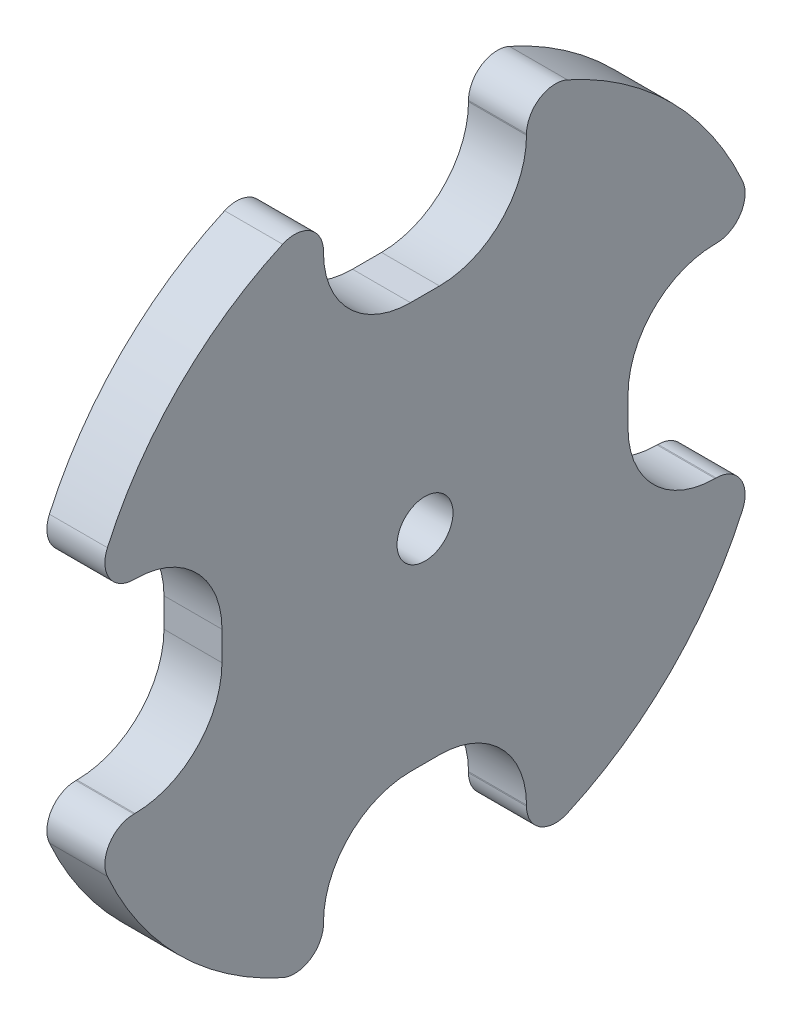
ISO-10303-21;
HEADER;
FILE_DESCRIPTION(('STEP AP214'),'2;1');
FILE_NAME('part.step','',(''),(''),'','','');
FILE_SCHEMA(('AUTOMOTIVE_DESIGN { 1 0 10303 214 1 1 1 1 }'));
ENDSEC;
DATA;
#1=APPLICATION_CONTEXT('core data for automotive mechanical design processes');
#2=APPLICATION_PROTOCOL_DEFINITION('international standard','automotive_design',2000,#1);
#3=PRODUCT_CONTEXT('',#1,'mechanical');
#4=PRODUCT('Part','Part','',(#3));
#5=PRODUCT_RELATED_PRODUCT_CATEGORY('part','',(#4));
#6=PRODUCT_DEFINITION_FORMATION('','',#4);
#7=PRODUCT_DEFINITION_CONTEXT('part definition',#1,'design');
#8=PRODUCT_DEFINITION('design','',#6,#7);
#9=PRODUCT_DEFINITION_SHAPE('','',#8);
#10=(LENGTH_UNIT() NAMED_UNIT(*) SI_UNIT(.MILLI.,.METRE.));
#11=(NAMED_UNIT(*) PLANE_ANGLE_UNIT() SI_UNIT($,.RADIAN.));
#12=(NAMED_UNIT(*) SI_UNIT($,.STERADIAN.) SOLID_ANGLE_UNIT());
#13=UNCERTAINTY_MEASURE_WITH_UNIT(LENGTH_MEASURE(1.E-05),#10,'distance_accuracy_value','');
#14=(GEOMETRIC_REPRESENTATION_CONTEXT(3) GLOBAL_UNCERTAINTY_ASSIGNED_CONTEXT((#13)) GLOBAL_UNIT_ASSIGNED_CONTEXT((#10,
#11,#12)) REPRESENTATION_CONTEXT('',''));
#15=CARTESIAN_POINT('',(0.,0.,0.));
#16=DIRECTION('',(0.,0.,1.));
#17=DIRECTION('',(1.,0.,0.));
#18=AXIS2_PLACEMENT_3D('',#15,#16,#17);
#19=CARTESIAN_POINT('',(2.,0.,0.));
#20=DIRECTION('',(-1.,0.,0.));
#21=DIRECTION('',(0.,0.,1.));
#22=AXIS2_PLACEMENT_3D('',#19,#20,#21);
#23=CYLINDRICAL_SURFACE('',#22,12.);
#24=CARTESIAN_POINT('',(0.,0.,0.));
#25=DIRECTION('',(1.,0.,0.));
#26=DIRECTION('',(0.,0.,-1.));
#27=AXIS2_PLACEMENT_3D('',#24,#25,#26);
#28=CIRCLE('',#27,12.);
#29=CARTESIAN_POINT('',(0.,10.9499235817553,4.90909090909091));
#30=VERTEX_POINT('',#29);
#31=CARTESIAN_POINT('',(0.,4.90909090909102,10.9499235817553));
#32=VERTEX_POINT('',#31);
#33=EDGE_CURVE('E414',#30,#32,#28,.T.);
#34=ORIENTED_EDGE('',*,*,#33,.T.);
#35=DIRECTION('',(-1.,0.,0.));
#36=VECTOR('',#35,1.);
#37=CARTESIAN_POINT('',(2.,4.90909090909102,10.9499235817553));
#38=LINE('',#37,#36);
#39=CARTESIAN_POINT('',(2.,4.90909090909102,10.9499235817553));
#40=VERTEX_POINT('',#39);
#41=EDGE_CURVE('E471',#32,#40,#38,.F.);
#42=ORIENTED_EDGE('',*,*,#41,.T.);
#43=CARTESIAN_POINT('',(2.,0.,0.));
#44=DIRECTION('',(1.,0.,0.));
#45=DIRECTION('',(0.,0.,-1.));
#46=AXIS2_PLACEMENT_3D('',#43,#44,#45);
#47=CIRCLE('',#46,12.);
#48=CARTESIAN_POINT('',(2.,10.9499235817553,4.90909090909091));
#49=VERTEX_POINT('',#48);
#50=EDGE_CURVE('E410',#49,#40,#47,.T.);
#51=ORIENTED_EDGE('',*,*,#50,.F.);
#52=DIRECTION('',(-1.,0.,0.));
#53=VECTOR('',#52,1.);
#54=CARTESIAN_POINT('',(2.,10.9499235817553,4.90909090909091));
#55=LINE('',#54,#53);
#56=EDGE_CURVE('E468',#49,#30,#55,.T.);
#57=ORIENTED_EDGE('',*,*,#56,.T.);
#58=EDGE_LOOP('',(#34,#42,#51,#57));
#59=FACE_BOUND('',#58,.T.);
#60=ADVANCED_FACE('F37',(#59),#23,.T.);
#61=CARTESIAN_POINT('',(2.,0.,0.));
#62=DIRECTION('',(1.,0.,0.));
#63=DIRECTION('',(0.,0.,-1.));
#64=AXIS2_PLACEMENT_3D('',#61,#62,#63);
#65=PLANE('',#64);
#66=CARTESIAN_POINT('',(2.,0.,0.));
#67=DIRECTION('',(1.,0.,0.));
#68=DIRECTION('',(0.,0.,-1.));
#69=AXIS2_PLACEMENT_3D('',#66,#67,#68);
#70=CIRCLE('',#69,0.965);
#71=CARTESIAN_POINT('',(2.,0.,-0.965));
#72=VERTEX_POINT('',#71);
#73=EDGE_CURVE('E406',#72,#72,#70,.T.);
#74=ORIENTED_EDGE('',*,*,#73,.F.);
#75=EDGE_LOOP('',(#74));
#76=FACE_BOUND('',#75,.T.);
#77=DIRECTION('',(0.,-1.,0.));
#78=VECTOR('',#77,1.);
#79=CARTESIAN_POINT('',(2.,0.,-3.5));
#80=LINE('',#79,#78);
#81=CARTESIAN_POINT('',(2.,-10.,-3.5));
#82=VERTEX_POINT('',#81);
#83=CARTESIAN_POINT('',(2.,-10.0374299499424,-3.5));
#84=VERTEX_POINT('',#83);
#85=EDGE_CURVE('E308',#82,#84,#80,.T.);
#86=ORIENTED_EDGE('',*,*,#85,.T.);
#87=CARTESIAN_POINT('',(2.,-10.0374299499424,-4.5));
#88=DIRECTION('',(1.,0.,0.));
#89=DIRECTION('',(0.,0.,-1.));
#90=AXIS2_PLACEMENT_3D('',#87,#88,#89);
#91=CIRCLE('',#90,1.);
#92=CARTESIAN_POINT('',(2.,-10.9499235817553,-4.90909090909091));
#93=VERTEX_POINT('',#92);
#94=EDGE_CURVE('E453',#84,#93,#91,.T.);
#95=ORIENTED_EDGE('',*,*,#94,.T.);
#96=CARTESIAN_POINT('',(2.,-4.90909090909095,-10.9499235817553));
#97=VERTEX_POINT('',#96);
#98=EDGE_CURVE('E403',#93,#97,#47,.T.);
#99=ORIENTED_EDGE('',*,*,#98,.T.);
#100=CARTESIAN_POINT('',(2.,-4.50000000000004,-10.0374299499424));
#101=DIRECTION('',(1.,0.,0.));
#102=DIRECTION('',(0.,0.,-1.));
#103=AXIS2_PLACEMENT_3D('',#100,#101,#102);
#104=CIRCLE('',#103,1.);
#105=CARTESIAN_POINT('',(2.,-3.50000000000004,-10.0374299499424));
#106=VERTEX_POINT('',#105);
#107=EDGE_CURVE('E445',#97,#106,#104,.T.);
#108=ORIENTED_EDGE('',*,*,#107,.T.);
#109=DIRECTION('',(0.,0.,-1.));
#110=VECTOR('',#109,1.);
#111=CARTESIAN_POINT('',(2.,-3.5,0.));
#112=LINE('',#111,#110);
#113=CARTESIAN_POINT('',(2.,-3.50000000000004,-9.99999999999999));
#114=VERTEX_POINT('',#113);
#115=EDGE_CURVE('E340',#114,#106,#112,.T.);
#116=ORIENTED_EDGE('',*,*,#115,.F.);
#117=CARTESIAN_POINT('',(2.,-0.500000000000035,-10.));
#118=DIRECTION('',(1.,0.,0.));
#119=DIRECTION('',(0.,-1.,0.));
#120=AXIS2_PLACEMENT_3D('',#117,#118,#119);
#121=CIRCLE('',#120,3.);
#122=CARTESIAN_POINT('',(2.,-0.500000000000024,-7.));
#123=VERTEX_POINT('',#122);
#124=EDGE_CURVE('E338',#123,#114,#121,.T.);
#125=ORIENTED_EDGE('',*,*,#124,.F.);
#126=DIRECTION('',(0.,-1.,0.));
#127=VECTOR('',#126,1.);
#128=CARTESIAN_POINT('',(2.,0.,-7.));
#129=LINE('',#128,#127);
#130=CARTESIAN_POINT('',(2.,0.499999999999976,-7.));
#131=VERTEX_POINT('',#130);
#132=EDGE_CURVE('E335',#131,#123,#129,.T.);
#133=ORIENTED_EDGE('',*,*,#132,.F.);
#134=CARTESIAN_POINT('',(2.,0.499999999999965,-10.));
#135=DIRECTION('',(1.,0.,0.));
#136=DIRECTION('',(0.,-1.,0.));
#137=AXIS2_PLACEMENT_3D('',#134,#135,#136);
#138=CIRCLE('',#137,3.);
#139=CARTESIAN_POINT('',(2.,3.49999999999996,-10.));
#140=VERTEX_POINT('',#139);
#141=EDGE_CURVE('E332',#131,#140,#138,.F.);
#142=ORIENTED_EDGE('',*,*,#141,.T.);
#143=DIRECTION('',(0.,0.,-1.));
#144=VECTOR('',#143,1.);
#145=CARTESIAN_POINT('',(2.,3.5,0.));
#146=LINE('',#145,#144);
#147=CARTESIAN_POINT('',(2.,3.49999999999996,-10.0374299499424));
#148=VERTEX_POINT('',#147);
#149=EDGE_CURVE('E343',#140,#148,#146,.T.);
#150=ORIENTED_EDGE('',*,*,#149,.T.);
#151=CARTESIAN_POINT('',(2.,4.49999999999997,-10.0374299499424));
#152=DIRECTION('',(1.,0.,0.));
#153=DIRECTION('',(0.,0.,-1.));
#154=AXIS2_PLACEMENT_3D('',#151,#152,#153);
#155=CIRCLE('',#154,1.);
#156=CARTESIAN_POINT('',(2.,4.90909090909087,-10.9499235817553));
#157=VERTEX_POINT('',#156);
#158=EDGE_CURVE('E443',#148,#157,#155,.T.);
#159=ORIENTED_EDGE('',*,*,#158,.T.);
#160=CARTESIAN_POINT('',(2.,10.9499235817553,-4.90909090909091));
#161=VERTEX_POINT('',#160);
#162=EDGE_CURVE('E401',#157,#161,#47,.T.);
#163=ORIENTED_EDGE('',*,*,#162,.T.);
#164=CARTESIAN_POINT('',(2.,10.0374299499424,-4.5));
#165=DIRECTION('',(1.,0.,0.));
#166=DIRECTION('',(0.,0.,-1.));
#167=AXIS2_PLACEMENT_3D('',#164,#165,#166);
#168=CIRCLE('',#167,1.);
#169=CARTESIAN_POINT('',(2.,10.0374299499424,-3.5));
#170=VERTEX_POINT('',#169);
#171=EDGE_CURVE('E58',#161,#170,#168,.T.);
#172=ORIENTED_EDGE('',*,*,#171,.T.);
#173=DIRECTION('',(0.,1.,0.));
#174=VECTOR('',#173,1.);
#175=CARTESIAN_POINT('',(2.,0.,-3.5));
#176=LINE('',#175,#174);
#177=CARTESIAN_POINT('',(2.,10.,-3.5));
#178=VERTEX_POINT('',#177);
#179=EDGE_CURVE('E376',#178,#170,#176,.T.);
#180=ORIENTED_EDGE('',*,*,#179,.F.);
#181=CARTESIAN_POINT('',(2.,10.,-0.5));
#182=DIRECTION('',(1.,0.,0.));
#183=DIRECTION('',(0.,0.,-1.));
#184=AXIS2_PLACEMENT_3D('',#181,#182,#183);
#185=CIRCLE('',#184,3.);
#186=CARTESIAN_POINT('',(2.,7.,-0.5));
#187=VERTEX_POINT('',#186);
#188=EDGE_CURVE('E374',#187,#178,#185,.T.);
#189=ORIENTED_EDGE('',*,*,#188,.F.);
#190=DIRECTION('',(0.,0.,-1.));
#191=VECTOR('',#190,1.);
#192=CARTESIAN_POINT('',(2.,7.,0.));
#193=LINE('',#192,#191);
#194=CARTESIAN_POINT('',(2.,7.,0.5));
#195=VERTEX_POINT('',#194);
#196=EDGE_CURVE('E371',#195,#187,#193,.T.);
#197=ORIENTED_EDGE('',*,*,#196,.F.);
#198=CARTESIAN_POINT('',(2.,10.,0.5));
#199=DIRECTION('',(1.,0.,0.));
#200=DIRECTION('',(0.,0.,-1.));
#201=AXIS2_PLACEMENT_3D('',#198,#199,#200);
#202=CIRCLE('',#201,3.);
#203=CARTESIAN_POINT('',(2.,10.,3.5));
#204=VERTEX_POINT('',#203);
#205=EDGE_CURVE('E368',#195,#204,#202,.F.);
#206=ORIENTED_EDGE('',*,*,#205,.T.);
#207=DIRECTION('',(0.,1.,0.));
#208=VECTOR('',#207,1.);
#209=CARTESIAN_POINT('',(2.,0.,3.5));
#210=LINE('',#209,#208);
#211=CARTESIAN_POINT('',(2.,10.0374299499424,3.5));
#212=VERTEX_POINT('',#211);
#213=EDGE_CURVE('E378',#204,#212,#210,.T.);
#214=ORIENTED_EDGE('',*,*,#213,.T.);
#215=CARTESIAN_POINT('',(2.,10.0374299499424,4.5));
#216=DIRECTION('',(1.,0.,0.));
#217=DIRECTION('',(0.,0.,-1.));
#218=AXIS2_PLACEMENT_3D('',#215,#216,#217);
#219=CIRCLE('',#218,1.);
#220=EDGE_CURVE('E440',#212,#49,#219,.T.);
#221=ORIENTED_EDGE('',*,*,#220,.T.);
#222=ORIENTED_EDGE('',*,*,#50,.T.);
#223=CARTESIAN_POINT('',(2.,4.50000000000011,10.0374299499423));
#224=DIRECTION('',(1.,0.,0.));
#225=DIRECTION('',(0.,0.,-1.));
#226=AXIS2_PLACEMENT_3D('',#223,#224,#225);
#227=CIRCLE('',#226,1.);
#228=CARTESIAN_POINT('',(2.,3.5000000000001,10.0374299499423));
#229=VERTEX_POINT('',#228);
#230=EDGE_CURVE('E447',#40,#229,#227,.T.);
#231=ORIENTED_EDGE('',*,*,#230,.T.);
#232=DIRECTION('',(0.,0.,1.));
#233=VECTOR('',#232,1.);
#234=CARTESIAN_POINT('',(2.,3.5,0.));
#235=LINE('',#234,#233);
#236=CARTESIAN_POINT('',(2.,3.5000000000001,9.99999999999996));
#237=VERTEX_POINT('',#236);
#238=EDGE_CURVE('E275',#237,#229,#235,.T.);
#239=ORIENTED_EDGE('',*,*,#238,.F.);
#240=CARTESIAN_POINT('',(2.,0.500000000000105,9.99999999999999));
#241=DIRECTION('',(1.,0.,0.));
#242=DIRECTION('',(0.,1.,0.));
#243=AXIS2_PLACEMENT_3D('',#240,#241,#242);
#244=CIRCLE('',#243,3.);
#245=CARTESIAN_POINT('',(2.,0.500000000000073,6.99999999999999));
#246=VERTEX_POINT('',#245);
#247=EDGE_CURVE('E273',#246,#237,#244,.T.);
#248=ORIENTED_EDGE('',*,*,#247,.F.);
#249=DIRECTION('',(0.,1.,0.));
#250=VECTOR('',#249,1.);
#251=CARTESIAN_POINT('',(2.,0.,7.));
#252=LINE('',#251,#250);
#253=CARTESIAN_POINT('',(2.,-0.499999999999927,7.));
#254=VERTEX_POINT('',#253);
#255=EDGE_CURVE('E251',#254,#246,#252,.T.);
#256=ORIENTED_EDGE('',*,*,#255,.F.);
#257=CARTESIAN_POINT('',(2.,-0.499999999999895,10.));
#258=DIRECTION('',(1.,0.,0.));
#259=DIRECTION('',(0.,1.,0.));
#260=AXIS2_PLACEMENT_3D('',#257,#258,#259);
#261=CIRCLE('',#260,3.);
#262=CARTESIAN_POINT('',(2.,-3.4999999999999,10.));
#263=VERTEX_POINT('',#262);
#264=EDGE_CURVE('E261',#254,#263,#261,.F.);
#265=ORIENTED_EDGE('',*,*,#264,.T.);
#266=DIRECTION('',(0.,0.,1.));
#267=VECTOR('',#266,1.);
#268=CARTESIAN_POINT('',(2.,-3.5,0.));
#269=LINE('',#268,#267);
#270=CARTESIAN_POINT('',(2.,-3.4999999999999,10.0374299499424));
#271=VERTEX_POINT('',#270);
#272=EDGE_CURVE('E280',#263,#271,#269,.T.);
#273=ORIENTED_EDGE('',*,*,#272,.T.);
#274=CARTESIAN_POINT('',(2.,-4.4999999999999,10.0374299499424));
#275=DIRECTION('',(1.,0.,0.));
#276=DIRECTION('',(0.,0.,-1.));
#277=AXIS2_PLACEMENT_3D('',#274,#275,#276);
#278=CIRCLE('',#277,1.);
#279=CARTESIAN_POINT('',(2.,-4.90909090909079,10.9499235817554));
#280=VERTEX_POINT('',#279);
#281=EDGE_CURVE('E449',#271,#280,#278,.T.);
#282=ORIENTED_EDGE('',*,*,#281,.T.);
#283=CARTESIAN_POINT('',(2.,-10.9499235817553,4.90909090909091));
#284=VERTEX_POINT('',#283);
#285=EDGE_CURVE('E405',#280,#284,#47,.T.);
#286=ORIENTED_EDGE('',*,*,#285,.T.);
#287=CARTESIAN_POINT('',(2.,-10.0374299499424,4.5));
#288=DIRECTION('',(1.,0.,0.));
#289=DIRECTION('',(0.,0.,-1.));
#290=AXIS2_PLACEMENT_3D('',#287,#288,#289);
#291=CIRCLE('',#290,1.);
#292=CARTESIAN_POINT('',(2.,-10.0374299499424,3.5));
#293=VERTEX_POINT('',#292);
#294=EDGE_CURVE('E451',#284,#293,#291,.T.);
#295=ORIENTED_EDGE('',*,*,#294,.T.);
#296=DIRECTION('',(0.,-1.,0.));
#297=VECTOR('',#296,1.);
#298=CARTESIAN_POINT('',(2.,0.,3.5));
#299=LINE('',#298,#297);
#300=CARTESIAN_POINT('',(2.,-10.,3.5));
#301=VERTEX_POINT('',#300);
#302=EDGE_CURVE('E305',#301,#293,#299,.T.);
#303=ORIENTED_EDGE('',*,*,#302,.F.);
#304=CARTESIAN_POINT('',(2.,-10.,0.5));
#305=DIRECTION('',(1.,0.,0.));
#306=DIRECTION('',(0.,0.,1.));
#307=AXIS2_PLACEMENT_3D('',#304,#305,#306);
#308=CIRCLE('',#307,3.);
#309=CARTESIAN_POINT('',(2.,-7.,0.5));
#310=VERTEX_POINT('',#309);
#311=EDGE_CURVE('E303',#310,#301,#308,.T.);
#312=ORIENTED_EDGE('',*,*,#311,.F.);
#313=DIRECTION('',(0.,0.,1.));
#314=VECTOR('',#313,1.);
#315=CARTESIAN_POINT('',(2.,-7.,0.));
#316=LINE('',#315,#314);
#317=CARTESIAN_POINT('',(2.,-7.,-0.5));
#318=VERTEX_POINT('',#317);
#319=EDGE_CURVE('E300',#318,#310,#316,.T.);
#320=ORIENTED_EDGE('',*,*,#319,.F.);
#321=CARTESIAN_POINT('',(2.,-10.,-0.5));
#322=DIRECTION('',(1.,0.,0.));
#323=DIRECTION('',(0.,0.,1.));
#324=AXIS2_PLACEMENT_3D('',#321,#322,#323);
#325=CIRCLE('',#324,3.);
#326=EDGE_CURVE('E297',#318,#82,#325,.F.);
#327=ORIENTED_EDGE('',*,*,#326,.T.);
#328=EDGE_LOOP('',(#86,#95,#99,#108,#116,#125,#133,#142,#150,#159,#163,#172,#180,#189,#197,#206,
#214,#221,#222,#231,#239,#248,#256,#265,#273,#282,#286,#295,#303,#312,#320,#327));
#329=FACE_BOUND('',#328,.T.);
#330=ADVANCED_FACE('F271',(#76,#329),#65,.T.);
#331=CARTESIAN_POINT('',(0.,0.,0.));
#332=DIRECTION('',(1.,0.,0.));
#333=DIRECTION('',(0.,0.,-1.));
#334=AXIS2_PLACEMENT_3D('',#331,#332,#333);
#335=PLANE('',#334);
#336=CARTESIAN_POINT('',(0.,0.,0.));
#337=DIRECTION('',(1.,0.,0.));
#338=DIRECTION('',(0.,0.,-1.));
#339=AXIS2_PLACEMENT_3D('',#336,#337,#338);
#340=CIRCLE('',#339,0.965);
#341=CARTESIAN_POINT('',(0.,0.,-0.965));
#342=VERTEX_POINT('',#341);
#343=EDGE_CURVE('E404',#342,#342,#340,.T.);
#344=ORIENTED_EDGE('',*,*,#343,.T.);
#345=EDGE_LOOP('',(#344));
#346=FACE_BOUND('',#345,.T.);
#347=CARTESIAN_POINT('',(0.,-10.9499235817553,-4.90909090909091));
#348=VERTEX_POINT('',#347);
#349=CARTESIAN_POINT('',(0.,-4.90909090909095,-10.9499235817553));
#350=VERTEX_POINT('',#349);
#351=EDGE_CURVE('E415',#348,#350,#28,.T.);
#352=ORIENTED_EDGE('',*,*,#351,.F.);
#353=CARTESIAN_POINT('',(0.,-10.0374299499424,-4.5));
#354=DIRECTION('',(1.,0.,0.));
#355=DIRECTION('',(0.,0.,-1.));
#356=AXIS2_PLACEMENT_3D('',#353,#354,#355);
#357=CIRCLE('',#356,1.);
#358=CARTESIAN_POINT('',(0.,-10.0374299499424,-3.5));
#359=VERTEX_POINT('',#358);
#360=EDGE_CURVE('E436',#348,#359,#357,.F.);
#361=ORIENTED_EDGE('',*,*,#360,.T.);
#362=DIRECTION('',(0.,-1.,0.));
#363=VECTOR('',#362,1.);
#364=CARTESIAN_POINT('',(0.,0.,-3.5));
#365=LINE('',#364,#363);
#366=CARTESIAN_POINT('',(0.,-10.,-3.5));
#367=VERTEX_POINT('',#366);
#368=EDGE_CURVE('E301',#367,#359,#365,.T.);
#369=ORIENTED_EDGE('',*,*,#368,.F.);
#370=CARTESIAN_POINT('',(0.,-10.,-0.5));
#371=DIRECTION('',(1.,0.,0.));
#372=DIRECTION('',(0.,0.,1.));
#373=AXIS2_PLACEMENT_3D('',#370,#371,#372);
#374=CIRCLE('',#373,3.);
#375=CARTESIAN_POINT('',(0.,-7.,-0.5));
#376=VERTEX_POINT('',#375);
#377=EDGE_CURVE('E257',#376,#367,#374,.F.);
#378=ORIENTED_EDGE('',*,*,#377,.F.);
#379=DIRECTION('',(0.,0.,1.));
#380=VECTOR('',#379,1.);
#381=CARTESIAN_POINT('',(0.,-7.,0.));
#382=LINE('',#381,#380);
#383=CARTESIAN_POINT('',(0.,-7.,0.5));
#384=VERTEX_POINT('',#383);
#385=EDGE_CURVE('E312',#376,#384,#382,.T.);
#386=ORIENTED_EDGE('',*,*,#385,.T.);
#387=CARTESIAN_POINT('',(0.,-10.,0.5));
#388=DIRECTION('',(1.,0.,0.));
#389=DIRECTION('',(0.,0.,1.));
#390=AXIS2_PLACEMENT_3D('',#387,#388,#389);
#391=CIRCLE('',#390,3.);
#392=CARTESIAN_POINT('',(0.,-10.,3.5));
#393=VERTEX_POINT('',#392);
#394=EDGE_CURVE('E315',#384,#393,#391,.T.);
#395=ORIENTED_EDGE('',*,*,#394,.T.);
#396=DIRECTION('',(0.,-1.,0.));
#397=VECTOR('',#396,1.);
#398=CARTESIAN_POINT('',(0.,0.,3.5));
#399=LINE('',#398,#397);
#400=CARTESIAN_POINT('',(0.,-10.0374299499424,3.5));
#401=VERTEX_POINT('',#400);
#402=EDGE_CURVE('E318',#393,#401,#399,.T.);
#403=ORIENTED_EDGE('',*,*,#402,.T.);
#404=CARTESIAN_POINT('',(0.,-10.0374299499424,4.5));
#405=DIRECTION('',(1.,0.,0.));
#406=DIRECTION('',(0.,0.,-1.));
#407=AXIS2_PLACEMENT_3D('',#404,#405,#406);
#408=CIRCLE('',#407,1.);
#409=CARTESIAN_POINT('',(0.,-10.9499235817553,4.90909090909091));
#410=VERTEX_POINT('',#409);
#411=EDGE_CURVE('E434',#401,#410,#408,.F.);
#412=ORIENTED_EDGE('',*,*,#411,.T.);
#413=CARTESIAN_POINT('',(0.,-4.90909090909079,10.9499235817554));
#414=VERTEX_POINT('',#413);
#415=EDGE_CURVE('E411',#414,#410,#28,.T.);
#416=ORIENTED_EDGE('',*,*,#415,.F.);
#417=CARTESIAN_POINT('',(0.,-4.4999999999999,10.0374299499424));
#418=DIRECTION('',(1.,0.,0.));
#419=DIRECTION('',(0.,0.,-1.));
#420=AXIS2_PLACEMENT_3D('',#417,#418,#419);
#421=CIRCLE('',#420,1.);
#422=CARTESIAN_POINT('',(0.,-3.4999999999999,10.0374299499424));
#423=VERTEX_POINT('',#422);
#424=EDGE_CURVE('E432',#414,#423,#421,.F.);
#425=ORIENTED_EDGE('',*,*,#424,.T.);
#426=DIRECTION('',(0.,0.,1.));
#427=VECTOR('',#426,1.);
#428=CARTESIAN_POINT('',(0.,-3.5,0.));
#429=LINE('',#428,#427);
#430=CARTESIAN_POINT('',(0.,-3.4999999999999,10.));
#431=VERTEX_POINT('',#430);
#432=EDGE_CURVE('E267',#431,#423,#429,.T.);
#433=ORIENTED_EDGE('',*,*,#432,.F.);
#434=CARTESIAN_POINT('',(0.,-0.499999999999895,10.));
#435=DIRECTION('',(1.,0.,0.));
#436=DIRECTION('',(0.,1.,0.));
#437=AXIS2_PLACEMENT_3D('',#434,#435,#436);
#438=CIRCLE('',#437,3.);
#439=CARTESIAN_POINT('',(0.,-0.499999999999927,7.));
#440=VERTEX_POINT('',#439);
#441=EDGE_CURVE('E282',#440,#431,#438,.F.);
#442=ORIENTED_EDGE('',*,*,#441,.F.);
#443=DIRECTION('',(0.,1.,0.));
#444=VECTOR('',#443,1.);
#445=CARTESIAN_POINT('',(0.,0.,7.));
#446=LINE('',#445,#444);
#447=CARTESIAN_POINT('',(0.,0.500000000000073,6.99999999999999));
#448=VERTEX_POINT('',#447);
#449=EDGE_CURVE('E254',#440,#448,#446,.T.);
#450=ORIENTED_EDGE('',*,*,#449,.T.);
#451=CARTESIAN_POINT('',(0.,0.500000000000105,9.99999999999999));
#452=DIRECTION('',(1.,0.,0.));
#453=DIRECTION('',(0.,1.,0.));
#454=AXIS2_PLACEMENT_3D('',#451,#452,#453);
#455=CIRCLE('',#454,3.);
#456=CARTESIAN_POINT('',(0.,3.5000000000001,9.99999999999996));
#457=VERTEX_POINT('',#456);
#458=EDGE_CURVE('E285',#448,#457,#455,.T.);
#459=ORIENTED_EDGE('',*,*,#458,.T.);
#460=DIRECTION('',(0.,0.,1.));
#461=VECTOR('',#460,1.);
#462=CARTESIAN_POINT('',(0.,3.5,0.));
#463=LINE('',#462,#461);
#464=CARTESIAN_POINT('',(0.,3.5000000000001,10.0374299499423));
#465=VERTEX_POINT('',#464);
#466=EDGE_CURVE('E288',#457,#465,#463,.T.);
#467=ORIENTED_EDGE('',*,*,#466,.T.);
#468=CARTESIAN_POINT('',(0.,4.50000000000011,10.0374299499423));
#469=DIRECTION('',(1.,0.,0.));
#470=DIRECTION('',(0.,0.,-1.));
#471=AXIS2_PLACEMENT_3D('',#468,#469,#470);
#472=CIRCLE('',#471,1.);
#473=EDGE_CURVE('E430',#465,#32,#472,.F.);
#474=ORIENTED_EDGE('',*,*,#473,.T.);
#475=ORIENTED_EDGE('',*,*,#33,.F.);
#476=CARTESIAN_POINT('',(0.,10.0374299499424,4.5));
#477=DIRECTION('',(1.,0.,0.));
#478=DIRECTION('',(0.,0.,-1.));
#479=AXIS2_PLACEMENT_3D('',#476,#477,#478);
#480=CIRCLE('',#479,1.);
#481=CARTESIAN_POINT('',(0.,10.0374299499424,3.5));
#482=VERTEX_POINT('',#481);
#483=EDGE_CURVE('E422',#30,#482,#480,.F.);
#484=ORIENTED_EDGE('',*,*,#483,.T.);
#485=DIRECTION('',(0.,1.,0.));
#486=VECTOR('',#485,1.);
#487=CARTESIAN_POINT('',(0.,0.,3.5));
#488=LINE('',#487,#486);
#489=CARTESIAN_POINT('',(0.,10.,3.5));
#490=VERTEX_POINT('',#489);
#491=EDGE_CURVE('E372',#490,#482,#488,.T.);
#492=ORIENTED_EDGE('',*,*,#491,.F.);
#493=CARTESIAN_POINT('',(0.,10.,0.5));
#494=DIRECTION('',(1.,0.,0.));
#495=DIRECTION('',(0.,0.,-1.));
#496=AXIS2_PLACEMENT_3D('',#493,#494,#495);
#497=CIRCLE('',#496,3.);
#498=CARTESIAN_POINT('',(0.,7.,0.5));
#499=VERTEX_POINT('',#498);
#500=EDGE_CURVE('E367',#499,#490,#497,.F.);
#501=ORIENTED_EDGE('',*,*,#500,.F.);
#502=DIRECTION('',(0.,0.,-1.));
#503=VECTOR('',#502,1.);
#504=CARTESIAN_POINT('',(0.,7.,0.));
#505=LINE('',#504,#503);
#506=CARTESIAN_POINT('',(0.,7.,-0.5));
#507=VERTEX_POINT('',#506);
#508=EDGE_CURVE('E382',#499,#507,#505,.T.);
#509=ORIENTED_EDGE('',*,*,#508,.T.);
#510=CARTESIAN_POINT('',(0.,10.,-0.5));
#511=DIRECTION('',(1.,0.,0.));
#512=DIRECTION('',(0.,0.,-1.));
#513=AXIS2_PLACEMENT_3D('',#510,#511,#512);
#514=CIRCLE('',#513,3.);
#515=CARTESIAN_POINT('',(0.,10.,-3.5));
#516=VERTEX_POINT('',#515);
#517=EDGE_CURVE('E385',#507,#516,#514,.T.);
#518=ORIENTED_EDGE('',*,*,#517,.T.);
#519=DIRECTION('',(0.,1.,0.));
#520=VECTOR('',#519,1.);
#521=CARTESIAN_POINT('',(0.,0.,-3.5));
#522=LINE('',#521,#520);
#523=CARTESIAN_POINT('',(0.,10.0374299499424,-3.5));
#524=VERTEX_POINT('',#523);
#525=EDGE_CURVE('E388',#516,#524,#522,.T.);
#526=ORIENTED_EDGE('',*,*,#525,.T.);
#527=CARTESIAN_POINT('',(0.,10.0374299499424,-4.5));
#528=DIRECTION('',(1.,0.,0.));
#529=DIRECTION('',(0.,0.,-1.));
#530=AXIS2_PLACEMENT_3D('',#527,#528,#529);
#531=CIRCLE('',#530,1.);
#532=CARTESIAN_POINT('',(0.,10.9499235817553,-4.90909090909091));
#533=VERTEX_POINT('',#532);
#534=EDGE_CURVE('E424',#524,#533,#531,.F.);
#535=ORIENTED_EDGE('',*,*,#534,.T.);
#536=CARTESIAN_POINT('',(0.,4.90909090909087,-10.9499235817553));
#537=VERTEX_POINT('',#536);
#538=EDGE_CURVE('E400',#537,#533,#28,.T.);
#539=ORIENTED_EDGE('',*,*,#538,.F.);
#540=CARTESIAN_POINT('',(0.,4.49999999999997,-10.0374299499424));
#541=DIRECTION('',(1.,0.,0.));
#542=DIRECTION('',(0.,0.,-1.));
#543=AXIS2_PLACEMENT_3D('',#540,#541,#542);
#544=CIRCLE('',#543,1.);
#545=CARTESIAN_POINT('',(0.,3.49999999999996,-10.0374299499424));
#546=VERTEX_POINT('',#545);
#547=EDGE_CURVE('E426',#537,#546,#544,.F.);
#548=ORIENTED_EDGE('',*,*,#547,.T.);
#549=DIRECTION('',(0.,0.,-1.));
#550=VECTOR('',#549,1.);
#551=CARTESIAN_POINT('',(0.,3.5,0.));
#552=LINE('',#551,#550);
#553=CARTESIAN_POINT('',(0.,3.49999999999996,-10.));
#554=VERTEX_POINT('',#553);
#555=EDGE_CURVE('E336',#554,#546,#552,.T.);
#556=ORIENTED_EDGE('',*,*,#555,.F.);
#557=CARTESIAN_POINT('',(0.,0.499999999999965,-10.));
#558=DIRECTION('',(1.,0.,0.));
#559=DIRECTION('',(0.,-1.,0.));
#560=AXIS2_PLACEMENT_3D('',#557,#558,#559);
#561=CIRCLE('',#560,3.);
#562=CARTESIAN_POINT('',(0.,0.499999999999976,-7.));
#563=VERTEX_POINT('',#562);
#564=EDGE_CURVE('E331',#563,#554,#561,.F.);
#565=ORIENTED_EDGE('',*,*,#564,.F.);
#566=DIRECTION('',(0.,-1.,0.));
#567=VECTOR('',#566,1.);
#568=CARTESIAN_POINT('',(0.,0.,-7.));
#569=LINE('',#568,#567);
#570=CARTESIAN_POINT('',(0.,-0.500000000000024,-7.));
#571=VERTEX_POINT('',#570);
#572=EDGE_CURVE('E348',#563,#571,#569,.T.);
#573=ORIENTED_EDGE('',*,*,#572,.T.);
#574=CARTESIAN_POINT('',(0.,-0.500000000000035,-10.));
#575=DIRECTION('',(1.,0.,0.));
#576=DIRECTION('',(0.,-1.,0.));
#577=AXIS2_PLACEMENT_3D('',#574,#575,#576);
#578=CIRCLE('',#577,3.);
#579=CARTESIAN_POINT('',(0.,-3.50000000000004,-9.99999999999999));
#580=VERTEX_POINT('',#579);
#581=EDGE_CURVE('E351',#571,#580,#578,.T.);
#582=ORIENTED_EDGE('',*,*,#581,.T.);
#583=DIRECTION('',(0.,0.,-1.));
#584=VECTOR('',#583,1.);
#585=CARTESIAN_POINT('',(0.,-3.5,0.));
#586=LINE('',#585,#584);
#587=CARTESIAN_POINT('',(0.,-3.50000000000004,-10.0374299499424));
#588=VERTEX_POINT('',#587);
#589=EDGE_CURVE('E354',#580,#588,#586,.T.);
#590=ORIENTED_EDGE('',*,*,#589,.T.);
#591=CARTESIAN_POINT('',(0.,-4.50000000000004,-10.0374299499424));
#592=DIRECTION('',(1.,0.,0.));
#593=DIRECTION('',(0.,0.,-1.));
#594=AXIS2_PLACEMENT_3D('',#591,#592,#593);
#595=CIRCLE('',#594,1.);
#596=EDGE_CURVE('E428',#588,#350,#595,.F.);
#597=ORIENTED_EDGE('',*,*,#596,.T.);
#598=EDGE_LOOP('',(#352,#361,#369,#378,#386,#395,#403,#412,#416,#425,#433,#442,#450,#459,#467,
#474,#475,#484,#492,#501,#509,#518,#526,#535,#539,#548,#556,#565,#573,#582,#590,#597));
#599=FACE_BOUND('',#598,.T.);
#600=ADVANCED_FACE('F491',(#346,#599),#335,.F.);
#601=ORIENTED_EDGE('',*,*,#415,.T.);
#602=DIRECTION('',(-1.,0.,0.));
#603=VECTOR('',#602,1.);
#604=CARTESIAN_POINT('',(2.,-10.9499235817553,4.90909090909091));
#605=LINE('',#604,#603);
#606=EDGE_CURVE('E461',#410,#284,#605,.F.);
#607=ORIENTED_EDGE('',*,*,#606,.T.);
#608=ORIENTED_EDGE('',*,*,#285,.F.);
#609=DIRECTION('',(-1.,0.,0.));
#610=VECTOR('',#609,1.);
#611=CARTESIAN_POINT('',(2.,-4.90909090909079,10.9499235817554));
#612=LINE('',#611,#610);
#613=EDGE_CURVE('E458',#280,#414,#612,.T.);
#614=ORIENTED_EDGE('',*,*,#613,.T.);
#615=EDGE_LOOP('',(#601,#607,#608,#614));
#616=FACE_BOUND('',#615,.T.);
#617=ADVANCED_FACE('F536',(#616),#23,.T.);
#618=ORIENTED_EDGE('',*,*,#98,.F.);
#619=DIRECTION('',(-1.,0.,0.));
#620=VECTOR('',#619,1.);
#621=CARTESIAN_POINT('',(2.,-10.9499235817553,-4.90909090909091));
#622=LINE('',#621,#620);
#623=EDGE_CURVE('E419',#93,#348,#622,.T.);
#624=ORIENTED_EDGE('',*,*,#623,.T.);
#625=ORIENTED_EDGE('',*,*,#351,.T.);
#626=DIRECTION('',(-1.,0.,0.));
#627=VECTOR('',#626,1.);
#628=CARTESIAN_POINT('',(2.,-4.90909090909095,-10.9499235817553));
#629=LINE('',#628,#627);
#630=EDGE_CURVE('E409',#350,#97,#629,.F.);
#631=ORIENTED_EDGE('',*,*,#630,.T.);
#632=EDGE_LOOP('',(#618,#624,#625,#631));
#633=FACE_BOUND('',#632,.T.);
#634=ADVANCED_FACE('F545',(#633),#23,.T.);
#635=ORIENTED_EDGE('',*,*,#162,.F.);
#636=DIRECTION('',(-1.,0.,0.));
#637=VECTOR('',#636,1.);
#638=CARTESIAN_POINT('',(2.,4.90909090909087,-10.9499235817553));
#639=LINE('',#638,#637);
#640=EDGE_CURVE('E478',#157,#537,#639,.T.);
#641=ORIENTED_EDGE('',*,*,#640,.T.);
#642=ORIENTED_EDGE('',*,*,#538,.T.);
#643=DIRECTION('',(-1.,0.,0.));
#644=VECTOR('',#643,1.);
#645=CARTESIAN_POINT('',(2.,10.9499235817553,-4.90909090909091));
#646=LINE('',#645,#644);
#647=EDGE_CURVE('E476',#533,#161,#646,.F.);
#648=ORIENTED_EDGE('',*,*,#647,.T.);
#649=EDGE_LOOP('',(#635,#641,#642,#648));
#650=FACE_BOUND('',#649,.T.);
#651=ADVANCED_FACE('F522',(#650),#23,.T.);
#652=CARTESIAN_POINT('',(2.,0.,0.));
#653=DIRECTION('',(-1.,0.,0.));
#654=DIRECTION('',(0.,0.,1.));
#655=AXIS2_PLACEMENT_3D('',#652,#653,#654);
#656=CYLINDRICAL_SURFACE('',#655,0.965);
#657=ORIENTED_EDGE('',*,*,#73,.T.);
#658=EDGE_LOOP('',(#657));
#659=FACE_BOUND('',#658,.T.);
#660=ORIENTED_EDGE('',*,*,#343,.F.);
#661=EDGE_LOOP('',(#660));
#662=FACE_BOUND('',#661,.T.);
#663=ADVANCED_FACE('F548',(#659,#662),#656,.F.);
#664=CARTESIAN_POINT('',(2.,10.,0.5));
#665=DIRECTION('',(-1.,0.,0.));
#666=DIRECTION('',(0.,0.,1.));
#667=AXIS2_PLACEMENT_3D('',#664,#665,#666);
#668=CYLINDRICAL_SURFACE('',#667,3.);
#669=ORIENTED_EDGE('',*,*,#500,.T.);
#670=DIRECTION('',(-1.,0.,0.));
#671=VECTOR('',#670,1.);
#672=CARTESIAN_POINT('',(2.,10.,3.5));
#673=LINE('',#672,#671);
#674=EDGE_CURVE('E380',#204,#490,#673,.T.);
#675=ORIENTED_EDGE('',*,*,#674,.F.);
#676=ORIENTED_EDGE('',*,*,#205,.F.);
#677=DIRECTION('',(-1.,0.,0.));
#678=VECTOR('',#677,1.);
#679=CARTESIAN_POINT('',(2.,7.,0.5));
#680=LINE('',#679,#678);
#681=EDGE_CURVE('E398',#195,#499,#680,.T.);
#682=ORIENTED_EDGE('',*,*,#681,.T.);
#683=EDGE_LOOP('',(#669,#675,#676,#682));
#684=FACE_BOUND('',#683,.T.);
#685=ADVANCED_FACE('F506',(#684),#668,.F.);
#686=CARTESIAN_POINT('',(2.,7.,0.));
#687=DIRECTION('',(0.,1.,0.));
#688=DIRECTION('',(0.,0.,1.));
#689=AXIS2_PLACEMENT_3D('',#686,#687,#688);
#690=PLANE('',#689);
#691=ORIENTED_EDGE('',*,*,#508,.F.);
#692=ORIENTED_EDGE('',*,*,#681,.F.);
#693=ORIENTED_EDGE('',*,*,#196,.T.);
#694=DIRECTION('',(-1.,0.,0.));
#695=VECTOR('',#694,1.);
#696=CARTESIAN_POINT('',(2.,7.,-0.5));
#697=LINE('',#696,#695);
#698=EDGE_CURVE('E396',#187,#507,#697,.T.);
#699=ORIENTED_EDGE('',*,*,#698,.T.);
#700=EDGE_LOOP('',(#691,#692,#693,#699));
#701=FACE_BOUND('',#700,.T.);
#702=ADVANCED_FACE('F504',(#701),#690,.T.);
#703=CARTESIAN_POINT('',(2.,10.,-0.5));
#704=DIRECTION('',(-1.,0.,0.));
#705=DIRECTION('',(0.,0.,1.));
#706=AXIS2_PLACEMENT_3D('',#703,#704,#705);
#707=CYLINDRICAL_SURFACE('',#706,3.);
#708=ORIENTED_EDGE('',*,*,#517,.F.);
#709=ORIENTED_EDGE('',*,*,#698,.F.);
#710=ORIENTED_EDGE('',*,*,#188,.T.);
#711=DIRECTION('',(-1.,0.,0.));
#712=VECTOR('',#711,1.);
#713=CARTESIAN_POINT('',(2.,10.,-3.5));
#714=LINE('',#713,#712);
#715=EDGE_CURVE('E394',#178,#516,#714,.T.);
#716=ORIENTED_EDGE('',*,*,#715,.T.);
#717=EDGE_LOOP('',(#708,#709,#710,#716));
#718=FACE_BOUND('',#717,.T.);
#719=ADVANCED_FACE('F499',(#718),#707,.F.);
#720=CARTESIAN_POINT('',(2.,0.,-3.5));
#721=DIRECTION('',(0.,0.,1.));
#722=DIRECTION('',(1.,0.,0.));
#723=AXIS2_PLACEMENT_3D('',#720,#721,#722);
#724=PLANE('',#723);
#725=ORIENTED_EDGE('',*,*,#179,.T.);
#726=DIRECTION('',(1.,0.,0.));
#727=VECTOR('',#726,1.);
#728=CARTESIAN_POINT('',(0.,10.0374299499424,-3.5));
#729=LINE('',#728,#727);
#730=EDGE_CURVE('E45',#170,#524,#729,.F.);
#731=ORIENTED_EDGE('',*,*,#730,.T.);
#732=ORIENTED_EDGE('',*,*,#525,.F.);
#733=ORIENTED_EDGE('',*,*,#715,.F.);
#734=EDGE_LOOP('',(#725,#731,#732,#733));
#735=FACE_BOUND('',#734,.T.);
#736=ADVANCED_FACE('F486',(#735),#724,.T.);
#737=CARTESIAN_POINT('',(2.,0.,3.5));
#738=DIRECTION('',(0.,0.,1.));
#739=DIRECTION('',(1.,0.,0.));
#740=AXIS2_PLACEMENT_3D('',#737,#738,#739);
#741=PLANE('',#740);
#742=ORIENTED_EDGE('',*,*,#491,.T.);
#743=DIRECTION('',(-1.,0.,0.));
#744=VECTOR('',#743,1.);
#745=CARTESIAN_POINT('',(2.,10.0374299499424,3.5));
#746=LINE('',#745,#744);
#747=EDGE_CURVE('E11',#482,#212,#746,.F.);
#748=ORIENTED_EDGE('',*,*,#747,.T.);
#749=ORIENTED_EDGE('',*,*,#213,.F.);
#750=ORIENTED_EDGE('',*,*,#674,.T.);
#751=EDGE_LOOP('',(#742,#748,#749,#750));
#752=FACE_BOUND('',#751,.T.);
#753=ADVANCED_FACE('F508',(#752),#741,.F.);
#754=CARTESIAN_POINT('',(2.,0.499999999999965,-10.));
#755=DIRECTION('',(-1.,0.,0.));
#756=DIRECTION('',(0.,0.,1.));
#757=AXIS2_PLACEMENT_3D('',#754,#755,#756);
#758=CYLINDRICAL_SURFACE('',#757,3.);
#759=ORIENTED_EDGE('',*,*,#564,.T.);
#760=DIRECTION('',(-1.,0.,0.));
#761=VECTOR('',#760,1.);
#762=CARTESIAN_POINT('',(2.,3.49999999999996,-10.));
#763=LINE('',#762,#761);
#764=EDGE_CURVE('E346',#140,#554,#763,.T.);
#765=ORIENTED_EDGE('',*,*,#764,.F.);
#766=ORIENTED_EDGE('',*,*,#141,.F.);
#767=DIRECTION('',(-1.,0.,0.));
#768=VECTOR('',#767,1.);
#769=CARTESIAN_POINT('',(2.,0.499999999999976,-7.));
#770=LINE('',#769,#768);
#771=EDGE_CURVE('E365',#131,#563,#770,.T.);
#772=ORIENTED_EDGE('',*,*,#771,.T.);
#773=EDGE_LOOP('',(#759,#765,#766,#772));
#774=FACE_BOUND('',#773,.T.);
#775=ADVANCED_FACE('F647',(#774),#758,.F.);
#776=CARTESIAN_POINT('',(2.,0.,-7.));
#777=DIRECTION('',(0.,0.,-1.));
#778=DIRECTION('',(0.,1.,0.));
#779=AXIS2_PLACEMENT_3D('',#776,#777,#778);
#780=PLANE('',#779);
#781=ORIENTED_EDGE('',*,*,#572,.F.);
#782=ORIENTED_EDGE('',*,*,#771,.F.);
#783=ORIENTED_EDGE('',*,*,#132,.T.);
#784=DIRECTION('',(-1.,0.,0.));
#785=VECTOR('',#784,1.);
#786=CARTESIAN_POINT('',(2.,-0.500000000000024,-7.));
#787=LINE('',#786,#785);
#788=EDGE_CURVE('E363',#123,#571,#787,.T.);
#789=ORIENTED_EDGE('',*,*,#788,.T.);
#790=EDGE_LOOP('',(#781,#782,#783,#789));
#791=FACE_BOUND('',#790,.T.);
#792=ADVANCED_FACE('F643',(#791),#780,.T.);
#793=CARTESIAN_POINT('',(2.,-0.500000000000035,-10.));
#794=DIRECTION('',(-1.,0.,0.));
#795=DIRECTION('',(0.,0.,1.));
#796=AXIS2_PLACEMENT_3D('',#793,#794,#795);
#797=CYLINDRICAL_SURFACE('',#796,3.);
#798=ORIENTED_EDGE('',*,*,#581,.F.);
#799=ORIENTED_EDGE('',*,*,#788,.F.);
#800=ORIENTED_EDGE('',*,*,#124,.T.);
#801=DIRECTION('',(-1.,0.,0.));
#802=VECTOR('',#801,1.);
#803=CARTESIAN_POINT('',(2.,-3.50000000000004,-9.99999999999999));
#804=LINE('',#803,#802);
#805=EDGE_CURVE('E361',#114,#580,#804,.T.);
#806=ORIENTED_EDGE('',*,*,#805,.T.);
#807=EDGE_LOOP('',(#798,#799,#800,#806));
#808=FACE_BOUND('',#807,.T.);
#809=ADVANCED_FACE('F639',(#808),#797,.F.);
#810=CARTESIAN_POINT('',(2.,-3.5,0.));
#811=DIRECTION('',(0.,1.,0.));
#812=DIRECTION('',(0.,0.,1.));
#813=AXIS2_PLACEMENT_3D('',#810,#811,#812);
#814=PLANE('',#813);
#815=ORIENTED_EDGE('',*,*,#115,.T.);
#816=DIRECTION('',(1.,0.,0.));
#817=VECTOR('',#816,1.);
#818=CARTESIAN_POINT('',(0.,-3.50000000000004,-10.0374299499424));
#819=LINE('',#818,#817);
#820=EDGE_CURVE('E473',#106,#588,#819,.F.);
#821=ORIENTED_EDGE('',*,*,#820,.T.);
#822=ORIENTED_EDGE('',*,*,#589,.F.);
#823=ORIENTED_EDGE('',*,*,#805,.F.);
#824=EDGE_LOOP('',(#815,#821,#822,#823));
#825=FACE_BOUND('',#824,.T.);
#826=ADVANCED_FACE('F635',(#825),#814,.T.);
#827=CARTESIAN_POINT('',(2.,3.5,0.));
#828=DIRECTION('',(0.,1.,0.));
#829=DIRECTION('',(0.,0.,1.));
#830=AXIS2_PLACEMENT_3D('',#827,#828,#829);
#831=PLANE('',#830);
#832=ORIENTED_EDGE('',*,*,#555,.T.);
#833=DIRECTION('',(-1.,0.,0.));
#834=VECTOR('',#833,1.);
#835=CARTESIAN_POINT('',(2.,3.49999999999996,-10.0374299499424));
#836=LINE('',#835,#834);
#837=EDGE_CURVE('E481',#546,#148,#836,.F.);
#838=ORIENTED_EDGE('',*,*,#837,.T.);
#839=ORIENTED_EDGE('',*,*,#149,.F.);
#840=ORIENTED_EDGE('',*,*,#764,.T.);
#841=EDGE_LOOP('',(#832,#838,#839,#840));
#842=FACE_BOUND('',#841,.T.);
#843=ADVANCED_FACE('F632',(#842),#831,.F.);
#844=CARTESIAN_POINT('',(2.,-10.,-0.5));
#845=DIRECTION('',(-1.,0.,0.));
#846=DIRECTION('',(0.,0.,1.));
#847=AXIS2_PLACEMENT_3D('',#844,#845,#846);
#848=CYLINDRICAL_SURFACE('',#847,3.);
#849=ORIENTED_EDGE('',*,*,#377,.T.);
#850=DIRECTION('',(-1.,0.,0.));
#851=VECTOR('',#850,1.);
#852=CARTESIAN_POINT('',(2.,-10.,-3.5));
#853=LINE('',#852,#851);
#854=EDGE_CURVE('E310',#82,#367,#853,.T.);
#855=ORIENTED_EDGE('',*,*,#854,.F.);
#856=ORIENTED_EDGE('',*,*,#326,.F.);
#857=DIRECTION('',(-1.,0.,0.));
#858=VECTOR('',#857,1.);
#859=CARTESIAN_POINT('',(2.,-7.,-0.5));
#860=LINE('',#859,#858);
#861=EDGE_CURVE('E329',#318,#376,#860,.T.);
#862=ORIENTED_EDGE('',*,*,#861,.T.);
#863=EDGE_LOOP('',(#849,#855,#856,#862));
#864=FACE_BOUND('',#863,.T.);
#865=ADVANCED_FACE('F573',(#864),#848,.F.);
#866=CARTESIAN_POINT('',(2.,-7.,0.));
#867=DIRECTION('',(0.,-1.,0.));
#868=DIRECTION('',(0.,0.,-1.));
#869=AXIS2_PLACEMENT_3D('',#866,#867,#868);
#870=PLANE('',#869);
#871=ORIENTED_EDGE('',*,*,#385,.F.);
#872=ORIENTED_EDGE('',*,*,#861,.F.);
#873=ORIENTED_EDGE('',*,*,#319,.T.);
#874=DIRECTION('',(-1.,0.,0.));
#875=VECTOR('',#874,1.);
#876=CARTESIAN_POINT('',(2.,-7.,0.5));
#877=LINE('',#876,#875);
#878=EDGE_CURVE('E327',#310,#384,#877,.T.);
#879=ORIENTED_EDGE('',*,*,#878,.T.);
#880=EDGE_LOOP('',(#871,#872,#873,#879));
#881=FACE_BOUND('',#880,.T.);
#882=ADVANCED_FACE('F578',(#881),#870,.T.);
#883=CARTESIAN_POINT('',(2.,-10.,0.5));
#884=DIRECTION('',(-1.,0.,0.));
#885=DIRECTION('',(0.,0.,1.));
#886=AXIS2_PLACEMENT_3D('',#883,#884,#885);
#887=CYLINDRICAL_SURFACE('',#886,3.);
#888=ORIENTED_EDGE('',*,*,#394,.F.);
#889=ORIENTED_EDGE('',*,*,#878,.F.);
#890=ORIENTED_EDGE('',*,*,#311,.T.);
#891=DIRECTION('',(-1.,0.,0.));
#892=VECTOR('',#891,1.);
#893=CARTESIAN_POINT('',(2.,-10.,3.5));
#894=LINE('',#893,#892);
#895=EDGE_CURVE('E325',#301,#393,#894,.T.);
#896=ORIENTED_EDGE('',*,*,#895,.T.);
#897=EDGE_LOOP('',(#888,#889,#890,#896));
#898=FACE_BOUND('',#897,.T.);
#899=ADVANCED_FACE('F582',(#898),#887,.F.);
#900=CARTESIAN_POINT('',(2.,0.,3.5));
#901=DIRECTION('',(0.,0.,-1.));
#902=DIRECTION('',(-1.,0.,0.));
#903=AXIS2_PLACEMENT_3D('',#900,#901,#902);
#904=PLANE('',#903);
#905=ORIENTED_EDGE('',*,*,#302,.T.);
#906=DIRECTION('',(1.,0.,0.));
#907=VECTOR('',#906,1.);
#908=CARTESIAN_POINT('',(0.,-10.0374299499424,3.5));
#909=LINE('',#908,#907);
#910=EDGE_CURVE('E455',#293,#401,#909,.F.);
#911=ORIENTED_EDGE('',*,*,#910,.T.);
#912=ORIENTED_EDGE('',*,*,#402,.F.);
#913=ORIENTED_EDGE('',*,*,#895,.F.);
#914=EDGE_LOOP('',(#905,#911,#912,#913));
#915=FACE_BOUND('',#914,.T.);
#916=ADVANCED_FACE('F587',(#915),#904,.T.);
#917=CARTESIAN_POINT('',(2.,0.,-3.5));
#918=DIRECTION('',(0.,0.,-1.));
#919=DIRECTION('',(-1.,0.,0.));
#920=AXIS2_PLACEMENT_3D('',#917,#918,#919);
#921=PLANE('',#920);
#922=ORIENTED_EDGE('',*,*,#368,.T.);
#923=DIRECTION('',(-1.,0.,0.));
#924=VECTOR('',#923,1.);
#925=CARTESIAN_POINT('',(2.,-10.0374299499424,-3.5));
#926=LINE('',#925,#924);
#927=EDGE_CURVE('E438',#359,#84,#926,.F.);
#928=ORIENTED_EDGE('',*,*,#927,.T.);
#929=ORIENTED_EDGE('',*,*,#85,.F.);
#930=ORIENTED_EDGE('',*,*,#854,.T.);
#931=EDGE_LOOP('',(#922,#928,#929,#930));
#932=FACE_BOUND('',#931,.T.);
#933=ADVANCED_FACE('F569',(#932),#921,.F.);
#934=CARTESIAN_POINT('',(2.,-0.499999999999895,10.));
#935=DIRECTION('',(-1.,0.,0.));
#936=DIRECTION('',(0.,0.,1.));
#937=AXIS2_PLACEMENT_3D('',#934,#935,#936);
#938=CYLINDRICAL_SURFACE('',#937,3.);
#939=ORIENTED_EDGE('',*,*,#441,.T.);
#940=DIRECTION('',(-1.,0.,0.));
#941=VECTOR('',#940,1.);
#942=CARTESIAN_POINT('',(2.,-3.4999999999999,10.));
#943=LINE('',#942,#941);
#944=EDGE_CURVE('E264',#263,#431,#943,.T.);
#945=ORIENTED_EDGE('',*,*,#944,.F.);
#946=ORIENTED_EDGE('',*,*,#264,.F.);
#947=DIRECTION('',(-1.,0.,0.));
#948=VECTOR('',#947,1.);
#949=CARTESIAN_POINT('',(2.,-0.499999999999927,7.));
#950=LINE('',#949,#948);
#951=EDGE_CURVE('E247',#254,#440,#950,.T.);
#952=ORIENTED_EDGE('',*,*,#951,.T.);
#953=EDGE_LOOP('',(#939,#945,#946,#952));
#954=FACE_BOUND('',#953,.T.);
#955=ADVANCED_FACE('F262',(#954),#938,.F.);
#956=CARTESIAN_POINT('',(2.,0.,7.));
#957=DIRECTION('',(0.,0.,1.));
#958=DIRECTION('',(0.,-1.,0.));
#959=AXIS2_PLACEMENT_3D('',#956,#957,#958);
#960=PLANE('',#959);
#961=ORIENTED_EDGE('',*,*,#449,.F.);
#962=ORIENTED_EDGE('',*,*,#951,.F.);
#963=ORIENTED_EDGE('',*,*,#255,.T.);
#964=DIRECTION('',(-1.,0.,0.));
#965=VECTOR('',#964,1.);
#966=CARTESIAN_POINT('',(2.,0.500000000000073,6.99999999999999));
#967=LINE('',#966,#965);
#968=EDGE_CURVE('E258',#246,#448,#967,.T.);
#969=ORIENTED_EDGE('',*,*,#968,.T.);
#970=EDGE_LOOP('',(#961,#962,#963,#969));
#971=FACE_BOUND('',#970,.T.);
#972=ADVANCED_FACE('F249',(#971),#960,.T.);
#973=CARTESIAN_POINT('',(2.,0.500000000000105,9.99999999999999));
#974=DIRECTION('',(-1.,0.,0.));
#975=DIRECTION('',(0.,0.,1.));
#976=AXIS2_PLACEMENT_3D('',#973,#974,#975);
#977=CYLINDRICAL_SURFACE('',#976,3.);
#978=ORIENTED_EDGE('',*,*,#458,.F.);
#979=ORIENTED_EDGE('',*,*,#968,.F.);
#980=ORIENTED_EDGE('',*,*,#247,.T.);
#981=DIRECTION('',(-1.,0.,0.));
#982=VECTOR('',#981,1.);
#983=CARTESIAN_POINT('',(2.,3.5000000000001,9.99999999999996));
#984=LINE('',#983,#982);
#985=EDGE_CURVE('E294',#237,#457,#984,.T.);
#986=ORIENTED_EDGE('',*,*,#985,.T.);
#987=EDGE_LOOP('',(#978,#979,#980,#986));
#988=FACE_BOUND('',#987,.T.);
#989=ADVANCED_FACE('F608',(#988),#977,.F.);
#990=CARTESIAN_POINT('',(2.,3.5,0.));
#991=DIRECTION('',(0.,-1.,0.));
#992=DIRECTION('',(0.,0.,-1.));
#993=AXIS2_PLACEMENT_3D('',#990,#991,#992);
#994=PLANE('',#993);
#995=ORIENTED_EDGE('',*,*,#238,.T.);
#996=DIRECTION('',(1.,0.,0.));
#997=VECTOR('',#996,1.);
#998=CARTESIAN_POINT('',(0.,3.5000000000001,10.0374299499423));
#999=LINE('',#998,#997);
#1000=EDGE_CURVE('E465',#229,#465,#999,.F.);
#1001=ORIENTED_EDGE('',*,*,#1000,.T.);
#1002=ORIENTED_EDGE('',*,*,#466,.F.);
#1003=ORIENTED_EDGE('',*,*,#985,.F.);
#1004=EDGE_LOOP('',(#995,#1001,#1002,#1003));
#1005=FACE_BOUND('',#1004,.T.);
#1006=ADVANCED_FACE('F604',(#1005),#994,.T.);
#1007=CARTESIAN_POINT('',(2.,-3.5,0.));
#1008=DIRECTION('',(0.,-1.,0.));
#1009=DIRECTION('',(0.,0.,-1.));
#1010=AXIS2_PLACEMENT_3D('',#1007,#1008,#1009);
#1011=PLANE('',#1010);
#1012=ORIENTED_EDGE('',*,*,#432,.T.);
#1013=DIRECTION('',(-1.,0.,0.));
#1014=VECTOR('',#1013,1.);
#1015=CARTESIAN_POINT('',(2.,-3.4999999999999,10.0374299499424));
#1016=LINE('',#1015,#1014);
#1017=EDGE_CURVE('E463',#423,#271,#1016,.F.);
#1018=ORIENTED_EDGE('',*,*,#1017,.T.);
#1019=ORIENTED_EDGE('',*,*,#272,.F.);
#1020=ORIENTED_EDGE('',*,*,#944,.T.);
#1021=EDGE_LOOP('',(#1012,#1018,#1019,#1020));
#1022=FACE_BOUND('',#1021,.T.);
#1023=ADVANCED_FACE('F615',(#1022),#1011,.F.);
#1024=CARTESIAN_POINT('',(2.,-10.0374299499424,-4.5));
#1025=DIRECTION('',(-1.,0.,0.));
#1026=DIRECTION('',(0.,0.,1.));
#1027=AXIS2_PLACEMENT_3D('',#1024,#1025,#1026);
#1028=CYLINDRICAL_SURFACE('',#1027,1.);
#1029=ORIENTED_EDGE('',*,*,#94,.F.);
#1030=ORIENTED_EDGE('',*,*,#927,.F.);
#1031=ORIENTED_EDGE('',*,*,#360,.F.);
#1032=ORIENTED_EDGE('',*,*,#623,.F.);
#1033=EDGE_LOOP('',(#1029,#1030,#1031,#1032));
#1034=FACE_BOUND('',#1033,.T.);
#1035=ADVANCED_FACE('F564',(#1034),#1028,.T.);
#1036=CARTESIAN_POINT('',(2.,-10.0374299499424,4.5));
#1037=DIRECTION('',(-1.,0.,0.));
#1038=DIRECTION('',(0.,0.,1.));
#1039=AXIS2_PLACEMENT_3D('',#1036,#1037,#1038);
#1040=CYLINDRICAL_SURFACE('',#1039,1.);
#1041=ORIENTED_EDGE('',*,*,#294,.F.);
#1042=ORIENTED_EDGE('',*,*,#606,.F.);
#1043=ORIENTED_EDGE('',*,*,#411,.F.);
#1044=ORIENTED_EDGE('',*,*,#910,.F.);
#1045=EDGE_LOOP('',(#1041,#1042,#1043,#1044));
#1046=FACE_BOUND('',#1045,.T.);
#1047=ADVANCED_FACE('F596',(#1046),#1040,.T.);
#1048=CARTESIAN_POINT('',(2.,-4.4999999999999,10.0374299499424));
#1049=DIRECTION('',(-1.,0.,0.));
#1050=DIRECTION('',(0.,0.,1.));
#1051=AXIS2_PLACEMENT_3D('',#1048,#1049,#1050);
#1052=CYLINDRICAL_SURFACE('',#1051,1.);
#1053=ORIENTED_EDGE('',*,*,#281,.F.);
#1054=ORIENTED_EDGE('',*,*,#1017,.F.);
#1055=ORIENTED_EDGE('',*,*,#424,.F.);
#1056=ORIENTED_EDGE('',*,*,#613,.F.);
#1057=EDGE_LOOP('',(#1053,#1054,#1055,#1056));
#1058=FACE_BOUND('',#1057,.T.);
#1059=ADVANCED_FACE('F757',(#1058),#1052,.T.);
#1060=CARTESIAN_POINT('',(2.,4.50000000000011,10.0374299499423));
#1061=DIRECTION('',(-1.,0.,0.));
#1062=DIRECTION('',(0.,0.,1.));
#1063=AXIS2_PLACEMENT_3D('',#1060,#1061,#1062);
#1064=CYLINDRICAL_SURFACE('',#1063,1.);
#1065=ORIENTED_EDGE('',*,*,#230,.F.);
#1066=ORIENTED_EDGE('',*,*,#41,.F.);
#1067=ORIENTED_EDGE('',*,*,#473,.F.);
#1068=ORIENTED_EDGE('',*,*,#1000,.F.);
#1069=EDGE_LOOP('',(#1065,#1066,#1067,#1068));
#1070=FACE_BOUND('',#1069,.T.);
#1071=ADVANCED_FACE('F601',(#1070),#1064,.T.);
#1072=CARTESIAN_POINT('',(2.,-4.50000000000004,-10.0374299499424));
#1073=DIRECTION('',(-1.,0.,0.));
#1074=DIRECTION('',(0.,0.,1.));
#1075=AXIS2_PLACEMENT_3D('',#1072,#1073,#1074);
#1076=CYLINDRICAL_SURFACE('',#1075,1.);
#1077=ORIENTED_EDGE('',*,*,#107,.F.);
#1078=ORIENTED_EDGE('',*,*,#630,.F.);
#1079=ORIENTED_EDGE('',*,*,#596,.F.);
#1080=ORIENTED_EDGE('',*,*,#820,.F.);
#1081=EDGE_LOOP('',(#1077,#1078,#1079,#1080));
#1082=FACE_BOUND('',#1081,.T.);
#1083=ADVANCED_FACE('F531',(#1082),#1076,.T.);
#1084=CARTESIAN_POINT('',(2.,4.49999999999997,-10.0374299499424));
#1085=DIRECTION('',(-1.,0.,0.));
#1086=DIRECTION('',(0.,0.,1.));
#1087=AXIS2_PLACEMENT_3D('',#1084,#1085,#1086);
#1088=CYLINDRICAL_SURFACE('',#1087,1.);
#1089=ORIENTED_EDGE('',*,*,#158,.F.);
#1090=ORIENTED_EDGE('',*,*,#837,.F.);
#1091=ORIENTED_EDGE('',*,*,#547,.F.);
#1092=ORIENTED_EDGE('',*,*,#640,.F.);
#1093=EDGE_LOOP('',(#1089,#1090,#1091,#1092));
#1094=FACE_BOUND('',#1093,.T.);
#1095=ADVANCED_FACE('F526',(#1094),#1088,.T.);
#1096=CARTESIAN_POINT('',(2.,10.0374299499424,-4.5));
#1097=DIRECTION('',(-1.,0.,0.));
#1098=DIRECTION('',(0.,0.,1.));
#1099=AXIS2_PLACEMENT_3D('',#1096,#1097,#1098);
#1100=CYLINDRICAL_SURFACE('',#1099,1.);
#1101=ORIENTED_EDGE('',*,*,#171,.F.);
#1102=ORIENTED_EDGE('',*,*,#647,.F.);
#1103=ORIENTED_EDGE('',*,*,#534,.F.);
#1104=ORIENTED_EDGE('',*,*,#730,.F.);
#1105=EDGE_LOOP('',(#1101,#1102,#1103,#1104));
#1106=FACE_BOUND('',#1105,.T.);
#1107=ADVANCED_FACE('F524',(#1106),#1100,.T.);
#1108=CARTESIAN_POINT('',(2.,10.0374299499424,4.5));
#1109=DIRECTION('',(-1.,0.,0.));
#1110=DIRECTION('',(0.,0.,1.));
#1111=AXIS2_PLACEMENT_3D('',#1108,#1109,#1110);
#1112=CYLINDRICAL_SURFACE('',#1111,1.);
#1113=ORIENTED_EDGE('',*,*,#220,.F.);
#1114=ORIENTED_EDGE('',*,*,#747,.F.);
#1115=ORIENTED_EDGE('',*,*,#483,.F.);
#1116=ORIENTED_EDGE('',*,*,#56,.F.);
#1117=EDGE_LOOP('',(#1113,#1114,#1115,#1116));
#1118=FACE_BOUND('',#1117,.T.);
#1119=ADVANCED_FACE('F39',(#1118),#1112,.T.);
#1120=CLOSED_SHELL('',(#60,#330,#600,#617,#634,#651,#663,#685,#702,#719,#736,#753,#775,#792,
#809,#826,#843,#865,#882,#899,#916,#933,#955,#972,#989,#1006,#1023,#1035,#1047,#1059,#1071,
#1083,#1095,#1107,#1119));
#1121=MANIFOLD_SOLID_BREP('B2',#1120);
#1122=ADVANCED_BREP_SHAPE_REPRESENTATION('',(#18,#1121),#14);
#1123=SHAPE_DEFINITION_REPRESENTATION(#9,#1122);
ENDSEC;
END-ISO-10303-21;
